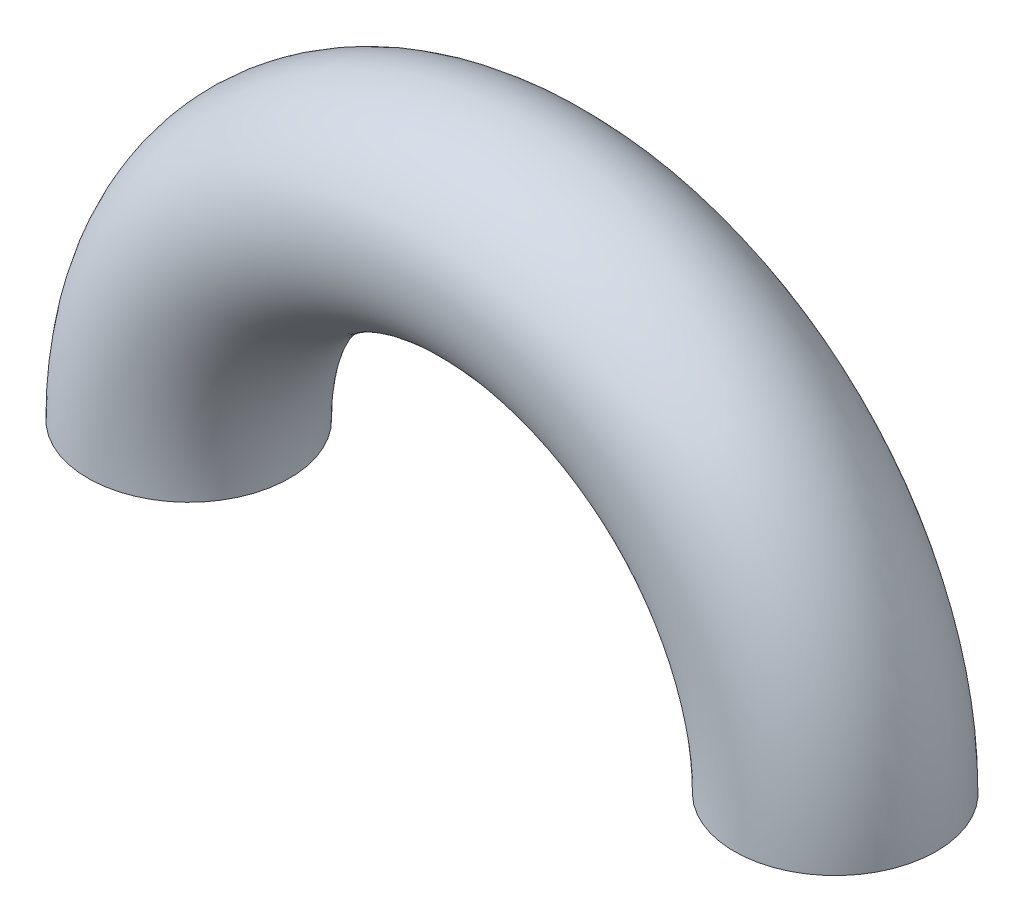
ISO-10303-21;
HEADER;
FILE_DESCRIPTION(('STEP AP214'),'2;1');
FILE_NAME('part.step','',(''),(''),'','','');
FILE_SCHEMA(('AUTOMOTIVE_DESIGN { 1 0 10303 214 1 1 1 1 }'));
ENDSEC;
DATA;
#1=APPLICATION_CONTEXT('core data for automotive mechanical design processes');
#2=APPLICATION_PROTOCOL_DEFINITION('international standard','automotive_design',2000,#1);
#3=PRODUCT_CONTEXT('',#1,'mechanical');
#4=PRODUCT('Part','Part','',(#3));
#5=PRODUCT_RELATED_PRODUCT_CATEGORY('part','',(#4));
#6=PRODUCT_DEFINITION_FORMATION('','',#4);
#7=PRODUCT_DEFINITION_CONTEXT('part definition',#1,'design');
#8=PRODUCT_DEFINITION('design','',#6,#7);
#9=PRODUCT_DEFINITION_SHAPE('','',#8);
#10=(LENGTH_UNIT() NAMED_UNIT(*) SI_UNIT(.MILLI.,.METRE.));
#11=(NAMED_UNIT(*) PLANE_ANGLE_UNIT() SI_UNIT($,.RADIAN.));
#12=(NAMED_UNIT(*) SI_UNIT($,.STERADIAN.) SOLID_ANGLE_UNIT());
#13=UNCERTAINTY_MEASURE_WITH_UNIT(LENGTH_MEASURE(1.E-05),#10,'distance_accuracy_value','');
#14=(GEOMETRIC_REPRESENTATION_CONTEXT(3) GLOBAL_UNCERTAINTY_ASSIGNED_CONTEXT((#13)) GLOBAL_UNIT_ASSIGNED_CONTEXT((#10,
#11,#12)) REPRESENTATION_CONTEXT('',''));
#15=CARTESIAN_POINT('',(0.,0.,0.));
#16=DIRECTION('',(0.,0.,1.));
#17=DIRECTION('',(1.,0.,0.));
#18=AXIS2_PLACEMENT_3D('',#15,#16,#17);
#19=CARTESIAN_POINT('',(0.,0.,0.));
#20=DIRECTION('',(0.,1.,0.));
#21=DIRECTION('',(0.,0.,1.));
#22=AXIS2_PLACEMENT_3D('',#19,#20,#21);
#23=PLANE('',#22);
#24=CARTESIAN_POINT('',(0.,0.,0.));
#25=DIRECTION('',(0.,1.,0.));
#26=DIRECTION('',(0.,0.,1.));
#27=AXIS2_PLACEMENT_3D('',#24,#25,#26);
#28=CIRCLE('',#27,1.5875);
#29=CARTESIAN_POINT('',(-1.5875,0.,0.));
#30=VERTEX_POINT('',#29);
#31=EDGE_CURVE('E37',#30,#30,#28,.T.);
#32=ORIENTED_EDGE('',*,*,#31,.F.);
#33=EDGE_LOOP('',(#32));
#34=FACE_BOUND('',#33,.T.);
#35=ADVANCED_FACE('F31',(#34),#23,.F.);
#36=CARTESIAN_POINT('',(10.16,0.,0.));
#37=DIRECTION('',(0.,-1.,0.));
#38=DIRECTION('',(0.,0.,1.));
#39=AXIS2_PLACEMENT_3D('',#36,#37,#38);
#40=PLANE('',#39);
#41=CARTESIAN_POINT('',(10.16,0.,0.));
#42=DIRECTION('',(0.,-1.,0.));
#43=DIRECTION('',(0.,0.,1.));
#44=AXIS2_PLACEMENT_3D('',#41,#42,#43);
#45=CIRCLE('',#44,1.5875);
#46=CARTESIAN_POINT('',(11.7475,0.,0.));
#47=VERTEX_POINT('',#46);
#48=EDGE_CURVE('E10',#47,#47,#45,.T.);
#49=ORIENTED_EDGE('',*,*,#48,.T.);
#50=EDGE_LOOP('',(#49));
#51=FACE_BOUND('',#50,.T.);
#52=ADVANCED_FACE('F46',(#51),#40,.T.);
#53=CARTESIAN_POINT('',(5.08,0.,0.));
#54=DIRECTION('',(0.,0.,-1.));
#55=DIRECTION('',(-1.,0.,0.));
#56=AXIS2_PLACEMENT_3D('',#53,#54,#55);
#57=TOROIDAL_SURFACE('',#56,5.08,1.5875);
#58=CARTESIAN_POINT('',(5.08,0.,0.));
#59=DIRECTION('',(0.,0.,-1.));
#60=DIRECTION('',(-1.,0.,0.));
#61=AXIS2_PLACEMENT_3D('',#58,#59,#60);
#62=CIRCLE('',#61,6.6675);
#63=EDGE_CURVE('',#30,#47,#62,.T.);
#64=ORIENTED_EDGE('',*,*,#31,.T.);
#65=ORIENTED_EDGE('',*,*,#48,.F.);
#66=ORIENTED_EDGE('',*,*,#63,.T.);
#67=ORIENTED_EDGE('',*,*,#63,.F.);
#68=EDGE_LOOP('',(#64,#66,#65,#67));
#69=FACE_BOUND('',#68,.T.);
#70=ADVANCED_FACE('F43',(#69),#57,.T.);
#71=CLOSED_SHELL('',(#35,#52,#70));
#72=MANIFOLD_SOLID_BREP('B2',#71);
#73=ADVANCED_BREP_SHAPE_REPRESENTATION('',(#18,#72),#14);
#74=SHAPE_DEFINITION_REPRESENTATION(#9,#73);
ENDSEC;
END-ISO-10303-21;
